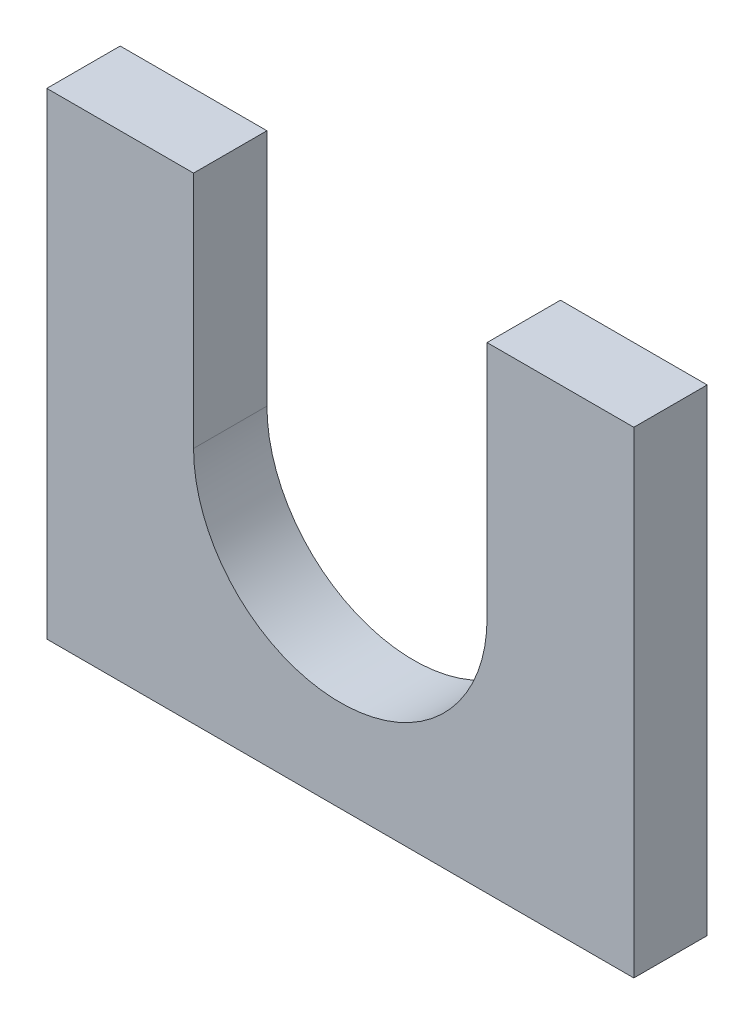
ISO-10303-21;
HEADER;
FILE_DESCRIPTION(('STEP AP214'),'2;1');
FILE_NAME('part.step','',(''),(''),'','','');
FILE_SCHEMA(('AUTOMOTIVE_DESIGN { 1 0 10303 214 1 1 1 1 }'));
ENDSEC;
DATA;
#1=APPLICATION_CONTEXT('core data for automotive mechanical design processes');
#2=APPLICATION_PROTOCOL_DEFINITION('international standard','automotive_design',2000,#1);
#3=PRODUCT_CONTEXT('',#1,'mechanical');
#4=PRODUCT('Part','Part','',(#3));
#5=PRODUCT_RELATED_PRODUCT_CATEGORY('part','',(#4));
#6=PRODUCT_DEFINITION_FORMATION('','',#4);
#7=PRODUCT_DEFINITION_CONTEXT('part definition',#1,'design');
#8=PRODUCT_DEFINITION('design','',#6,#7);
#9=PRODUCT_DEFINITION_SHAPE('','',#8);
#10=(LENGTH_UNIT() NAMED_UNIT(*) SI_UNIT(.MILLI.,.METRE.));
#11=(NAMED_UNIT(*) PLANE_ANGLE_UNIT() SI_UNIT($,.RADIAN.));
#12=(NAMED_UNIT(*) SI_UNIT($,.STERADIAN.) SOLID_ANGLE_UNIT());
#13=UNCERTAINTY_MEASURE_WITH_UNIT(LENGTH_MEASURE(1.E-05),#10,'distance_accuracy_value','');
#14=(GEOMETRIC_REPRESENTATION_CONTEXT(3) GLOBAL_UNCERTAINTY_ASSIGNED_CONTEXT((#13)) GLOBAL_UNIT_ASSIGNED_CONTEXT((#10,
#11,#12)) REPRESENTATION_CONTEXT('',''));
#15=CARTESIAN_POINT('',(0.,0.,0.));
#16=DIRECTION('',(0.,0.,1.));
#17=DIRECTION('',(1.,0.,0.));
#18=AXIS2_PLACEMENT_3D('',#15,#16,#17);
#19=CARTESIAN_POINT('',(0.,13.,0.));
#20=DIRECTION('',(0.,-1.,0.));
#21=DIRECTION('',(0.,0.,-1.));
#22=AXIS2_PLACEMENT_3D('',#19,#20,#21);
#23=PLANE('',#22);
#24=DIRECTION('',(-1.,0.,0.));
#25=VECTOR('',#24,1.);
#26=CARTESIAN_POINT('',(0.,13.,-2.));
#27=LINE('',#26,#25);
#28=CARTESIAN_POINT('',(16.,13.,-2.));
#29=VERTEX_POINT('',#28);
#30=CARTESIAN_POINT('',(12.,13.,-2.));
#31=VERTEX_POINT('',#30);
#32=EDGE_CURVE('E144',#29,#31,#27,.T.);
#33=ORIENTED_EDGE('',*,*,#32,.T.);
#34=DIRECTION('',(0.,0.,-1.));
#35=VECTOR('',#34,1.);
#36=CARTESIAN_POINT('',(12.,13.,0.));
#37=LINE('',#36,#35);
#38=CARTESIAN_POINT('',(12.,13.,0.));
#39=VERTEX_POINT('',#38);
#40=EDGE_CURVE('E135',#39,#31,#37,.T.);
#41=ORIENTED_EDGE('',*,*,#40,.F.);
#42=DIRECTION('',(1.,0.,0.));
#43=VECTOR('',#42,1.);
#44=CARTESIAN_POINT('',(0.,13.,0.));
#45=LINE('',#44,#43);
#46=CARTESIAN_POINT('',(16.,13.,0.));
#47=VERTEX_POINT('',#46);
#48=EDGE_CURVE('E140',#39,#47,#45,.T.);
#49=ORIENTED_EDGE('',*,*,#48,.T.);
#50=DIRECTION('',(0.,0.,-1.));
#51=VECTOR('',#50,1.);
#52=CARTESIAN_POINT('',(16.,13.,0.));
#53=LINE('',#52,#51);
#54=EDGE_CURVE('E142',#47,#29,#53,.T.);
#55=ORIENTED_EDGE('',*,*,#54,.T.);
#56=EDGE_LOOP('',(#33,#41,#49,#55));
#57=FACE_BOUND('',#56,.T.);
#58=ADVANCED_FACE('F33',(#57),#23,.F.);
#59=CARTESIAN_POINT('',(0.,13.,0.));
#60=DIRECTION('',(1.,0.,0.));
#61=DIRECTION('',(0.,0.,-1.));
#62=AXIS2_PLACEMENT_3D('',#59,#60,#61);
#63=PLANE('',#62);
#64=DIRECTION('',(0.,0.,1.));
#65=VECTOR('',#64,1.);
#66=CARTESIAN_POINT('',(0.,0.,0.));
#67=LINE('',#66,#65);
#68=CARTESIAN_POINT('',(0.,0.,-2.));
#69=VERTEX_POINT('',#68);
#70=CARTESIAN_POINT('',(0.,0.,0.));
#71=VERTEX_POINT('',#70);
#72=EDGE_CURVE('E134',#69,#71,#67,.T.);
#73=ORIENTED_EDGE('',*,*,#72,.T.);
#74=DIRECTION('',(0.,-1.,0.));
#75=VECTOR('',#74,1.);
#76=CARTESIAN_POINT('',(0.,13.,0.));
#77=LINE('',#76,#75);
#78=CARTESIAN_POINT('',(0.,13.,0.));
#79=VERTEX_POINT('',#78);
#80=EDGE_CURVE('E11',#79,#71,#77,.T.);
#81=ORIENTED_EDGE('',*,*,#80,.F.);
#82=DIRECTION('',(0.,0.,1.));
#83=VECTOR('',#82,1.);
#84=CARTESIAN_POINT('',(0.,13.,0.));
#85=LINE('',#84,#83);
#86=CARTESIAN_POINT('',(0.,13.,-2.));
#87=VERTEX_POINT('',#86);
#88=EDGE_CURVE('E138',#87,#79,#85,.T.);
#89=ORIENTED_EDGE('',*,*,#88,.F.);
#90=DIRECTION('',(0.,-1.,0.));
#91=VECTOR('',#90,1.);
#92=CARTESIAN_POINT('',(0.,13.,-2.));
#93=LINE('',#92,#91);
#94=EDGE_CURVE('E147',#87,#69,#93,.T.);
#95=ORIENTED_EDGE('',*,*,#94,.T.);
#96=EDGE_LOOP('',(#73,#81,#89,#95));
#97=FACE_BOUND('',#96,.T.);
#98=ADVANCED_FACE('F35',(#97),#63,.F.);
#99=CARTESIAN_POINT('',(0.,13.,0.));
#100=DIRECTION('',(0.,0.,-1.));
#101=DIRECTION('',(-1.,0.,0.));
#102=AXIS2_PLACEMENT_3D('',#99,#100,#101);
#103=PLANE('',#102);
#104=ORIENTED_EDGE('',*,*,#48,.F.);
#105=DIRECTION('',(0.,-1.,0.));
#106=VECTOR('',#105,1.);
#107=CARTESIAN_POINT('',(12.,13.,0.));
#108=LINE('',#107,#106);
#109=CARTESIAN_POINT('',(12.,6.5,0.));
#110=VERTEX_POINT('',#109);
#111=EDGE_CURVE('E117',#39,#110,#108,.T.);
#112=ORIENTED_EDGE('',*,*,#111,.T.);
#113=CARTESIAN_POINT('',(8.,6.5,0.));
#114=DIRECTION('',(0.,0.,-1.));
#115=DIRECTION('',(1.,0.,0.));
#116=AXIS2_PLACEMENT_3D('',#113,#114,#115);
#117=CIRCLE('',#116,4.);
#118=CARTESIAN_POINT('',(4.,6.5,0.));
#119=VERTEX_POINT('',#118);
#120=EDGE_CURVE('E112',#110,#119,#117,.T.);
#121=ORIENTED_EDGE('',*,*,#120,.T.);
#122=DIRECTION('',(0.,1.,0.));
#123=VECTOR('',#122,1.);
#124=CARTESIAN_POINT('',(4.,6.5,0.));
#125=LINE('',#124,#123);
#126=CARTESIAN_POINT('',(4.,13.,0.));
#127=VERTEX_POINT('',#126);
#128=EDGE_CURVE('E119',#119,#127,#125,.T.);
#129=ORIENTED_EDGE('',*,*,#128,.T.);
#130=EDGE_CURVE('E85',#79,#127,#45,.T.);
#131=ORIENTED_EDGE('',*,*,#130,.F.);
#132=ORIENTED_EDGE('',*,*,#80,.T.);
#133=DIRECTION('',(1.,0.,0.));
#134=VECTOR('',#133,1.);
#135=CARTESIAN_POINT('',(0.,0.,0.));
#136=LINE('',#135,#134);
#137=CARTESIAN_POINT('',(16.,0.,0.));
#138=VERTEX_POINT('',#137);
#139=EDGE_CURVE('E150',#71,#138,#136,.T.);
#140=ORIENTED_EDGE('',*,*,#139,.T.);
#141=DIRECTION('',(0.,-1.,0.));
#142=VECTOR('',#141,1.);
#143=CARTESIAN_POINT('',(16.,13.,0.));
#144=LINE('',#143,#142);
#145=EDGE_CURVE('E41',#47,#138,#144,.T.);
#146=ORIENTED_EDGE('',*,*,#145,.F.);
#147=EDGE_LOOP('',(#104,#112,#121,#129,#131,#132,#140,#146));
#148=FACE_BOUND('',#147,.T.);
#149=ADVANCED_FACE('F123',(#148),#103,.F.);
#150=CARTESIAN_POINT('',(16.,13.,0.));
#151=DIRECTION('',(-1.,0.,0.));
#152=DIRECTION('',(0.,0.,1.));
#153=AXIS2_PLACEMENT_3D('',#150,#151,#152);
#154=PLANE('',#153);
#155=DIRECTION('',(0.,0.,-1.));
#156=VECTOR('',#155,1.);
#157=CARTESIAN_POINT('',(16.,0.,0.));
#158=LINE('',#157,#156);
#159=CARTESIAN_POINT('',(16.,0.,-2.));
#160=VERTEX_POINT('',#159);
#161=EDGE_CURVE('E152',#138,#160,#158,.T.);
#162=ORIENTED_EDGE('',*,*,#161,.T.);
#163=DIRECTION('',(0.,-1.,0.));
#164=VECTOR('',#163,1.);
#165=CARTESIAN_POINT('',(16.,13.,-2.));
#166=LINE('',#165,#164);
#167=EDGE_CURVE('E156',#29,#160,#166,.T.);
#168=ORIENTED_EDGE('',*,*,#167,.F.);
#169=ORIENTED_EDGE('',*,*,#54,.F.);
#170=ORIENTED_EDGE('',*,*,#145,.T.);
#171=EDGE_LOOP('',(#162,#168,#169,#170));
#172=FACE_BOUND('',#171,.T.);
#173=ADVANCED_FACE('F162',(#172),#154,.F.);
#174=CARTESIAN_POINT('',(0.,13.,-2.));
#175=DIRECTION('',(0.,0.,1.));
#176=DIRECTION('',(1.,0.,0.));
#177=AXIS2_PLACEMENT_3D('',#174,#175,#176);
#178=PLANE('',#177);
#179=CARTESIAN_POINT('',(8.,6.5,-2.));
#180=DIRECTION('',(0.,0.,-1.));
#181=DIRECTION('',(1.,0.,0.));
#182=AXIS2_PLACEMENT_3D('',#179,#180,#181);
#183=CIRCLE('',#182,4.);
#184=CARTESIAN_POINT('',(12.,6.5,-2.));
#185=VERTEX_POINT('',#184);
#186=CARTESIAN_POINT('',(4.,6.5,-2.));
#187=VERTEX_POINT('',#186);
#188=EDGE_CURVE('E115',#185,#187,#183,.T.);
#189=ORIENTED_EDGE('',*,*,#188,.F.);
#190=DIRECTION('',(0.,-1.,0.));
#191=VECTOR('',#190,1.);
#192=CARTESIAN_POINT('',(12.,13.,-2.));
#193=LINE('',#192,#191);
#194=EDGE_CURVE('E124',#31,#185,#193,.T.);
#195=ORIENTED_EDGE('',*,*,#194,.F.);
#196=ORIENTED_EDGE('',*,*,#32,.F.);
#197=ORIENTED_EDGE('',*,*,#167,.T.);
#198=DIRECTION('',(-1.,0.,0.));
#199=VECTOR('',#198,1.);
#200=CARTESIAN_POINT('',(0.,0.,-2.));
#201=LINE('',#200,#199);
#202=EDGE_CURVE('E78',#160,#69,#201,.T.);
#203=ORIENTED_EDGE('',*,*,#202,.T.);
#204=ORIENTED_EDGE('',*,*,#94,.F.);
#205=CARTESIAN_POINT('',(4.,13.,-2.));
#206=VERTEX_POINT('',#205);
#207=EDGE_CURVE('E56',#206,#87,#27,.T.);
#208=ORIENTED_EDGE('',*,*,#207,.F.);
#209=DIRECTION('',(0.,1.,0.));
#210=VECTOR('',#209,1.);
#211=CARTESIAN_POINT('',(4.,6.5,-2.));
#212=LINE('',#211,#210);
#213=EDGE_CURVE('E48',#187,#206,#212,.T.);
#214=ORIENTED_EDGE('',*,*,#213,.F.);
#215=EDGE_LOOP('',(#189,#195,#196,#197,#203,#204,#208,#214));
#216=FACE_BOUND('',#215,.T.);
#217=ADVANCED_FACE('F170',(#216),#178,.F.);
#218=ORIENTED_EDGE('',*,*,#130,.T.);
#219=DIRECTION('',(0.,0.,-1.));
#220=VECTOR('',#219,1.);
#221=CARTESIAN_POINT('',(4.,13.,0.));
#222=LINE('',#221,#220);
#223=EDGE_CURVE('E116',#127,#206,#222,.T.);
#224=ORIENTED_EDGE('',*,*,#223,.T.);
#225=ORIENTED_EDGE('',*,*,#207,.T.);
#226=ORIENTED_EDGE('',*,*,#88,.T.);
#227=EDGE_LOOP('',(#218,#224,#225,#226));
#228=FACE_BOUND('',#227,.T.);
#229=ADVANCED_FACE('F187',(#228),#23,.F.);
#230=CARTESIAN_POINT('',(0.,0.,0.));
#231=DIRECTION('',(0.,-1.,0.));
#232=DIRECTION('',(0.,0.,-1.));
#233=AXIS2_PLACEMENT_3D('',#230,#231,#232);
#234=PLANE('',#233);
#235=ORIENTED_EDGE('',*,*,#72,.F.);
#236=ORIENTED_EDGE('',*,*,#202,.F.);
#237=ORIENTED_EDGE('',*,*,#161,.F.);
#238=ORIENTED_EDGE('',*,*,#139,.F.);
#239=EDGE_LOOP('',(#235,#236,#237,#238));
#240=FACE_BOUND('',#239,.T.);
#241=ADVANCED_FACE('F166',(#240),#234,.T.);
#242=CARTESIAN_POINT('',(8.,6.5,0.));
#243=DIRECTION('',(0.,0.,-1.));
#244=DIRECTION('',(-1.,0.,0.));
#245=AXIS2_PLACEMENT_3D('',#242,#243,#244);
#246=CYLINDRICAL_SURFACE('',#245,4.);
#247=ORIENTED_EDGE('',*,*,#188,.T.);
#248=DIRECTION('',(0.,0.,-1.));
#249=VECTOR('',#248,1.);
#250=CARTESIAN_POINT('',(4.,6.5,0.));
#251=LINE('',#250,#249);
#252=EDGE_CURVE('E108',#119,#187,#251,.T.);
#253=ORIENTED_EDGE('',*,*,#252,.F.);
#254=ORIENTED_EDGE('',*,*,#120,.F.);
#255=DIRECTION('',(0.,0.,-1.));
#256=VECTOR('',#255,1.);
#257=CARTESIAN_POINT('',(12.,6.5,0.));
#258=LINE('',#257,#256);
#259=EDGE_CURVE('E132',#110,#185,#258,.T.);
#260=ORIENTED_EDGE('',*,*,#259,.T.);
#261=EDGE_LOOP('',(#247,#253,#254,#260));
#262=FACE_BOUND('',#261,.T.);
#263=ADVANCED_FACE('F110',(#262),#246,.F.);
#264=CARTESIAN_POINT('',(12.,13.,0.));
#265=DIRECTION('',(1.,0.,0.));
#266=DIRECTION('',(0.,1.,0.));
#267=AXIS2_PLACEMENT_3D('',#264,#265,#266);
#268=PLANE('',#267);
#269=ORIENTED_EDGE('',*,*,#194,.T.);
#270=ORIENTED_EDGE('',*,*,#259,.F.);
#271=ORIENTED_EDGE('',*,*,#111,.F.);
#272=ORIENTED_EDGE('',*,*,#40,.T.);
#273=EDGE_LOOP('',(#269,#270,#271,#272));
#274=FACE_BOUND('',#273,.T.);
#275=ADVANCED_FACE('F176',(#274),#268,.F.);
#276=CARTESIAN_POINT('',(4.,6.5,0.));
#277=DIRECTION('',(-1.,0.,0.));
#278=DIRECTION('',(0.,-1.,0.));
#279=AXIS2_PLACEMENT_3D('',#276,#277,#278);
#280=PLANE('',#279);
#281=ORIENTED_EDGE('',*,*,#213,.T.);
#282=ORIENTED_EDGE('',*,*,#223,.F.);
#283=ORIENTED_EDGE('',*,*,#128,.F.);
#284=ORIENTED_EDGE('',*,*,#252,.T.);
#285=EDGE_LOOP('',(#281,#282,#283,#284));
#286=FACE_BOUND('',#285,.T.);
#287=ADVANCED_FACE('F120',(#286),#280,.F.);
#288=CLOSED_SHELL('',(#58,#98,#149,#173,#217,#229,#241,#263,#275,#287));
#289=MANIFOLD_SOLID_BREP('B2',#288);
#290=ADVANCED_BREP_SHAPE_REPRESENTATION('',(#18,#289),#14);
#291=SHAPE_DEFINITION_REPRESENTATION(#9,#290);
ENDSEC;
END-ISO-10303-21;
